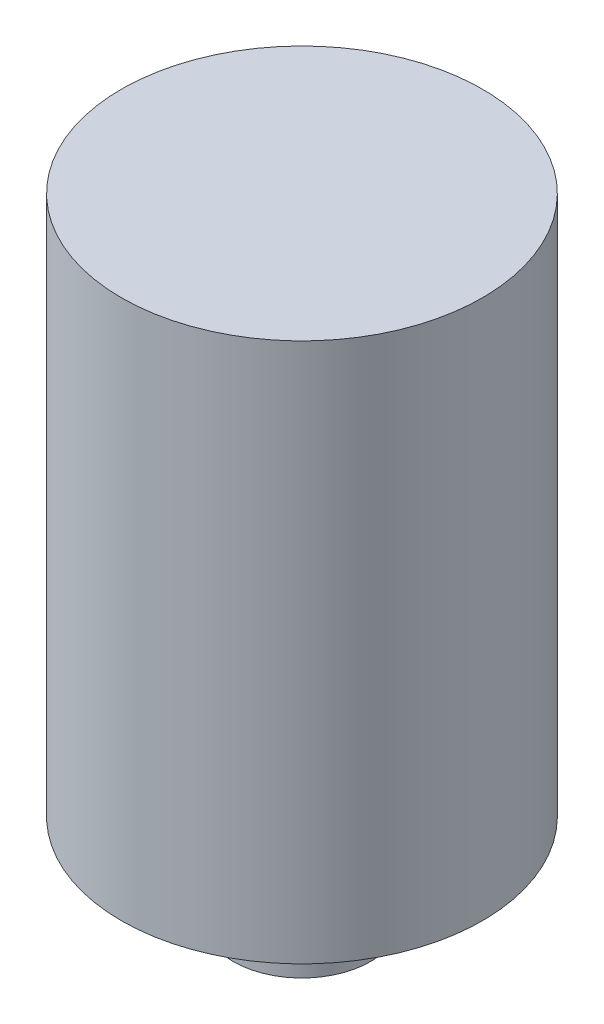
ISO-10303-21;
HEADER;
FILE_DESCRIPTION(('STEP AP214'),'2;1');
FILE_NAME('part.step','',(''),(''),'','','');
FILE_SCHEMA(('AUTOMOTIVE_DESIGN { 1 0 10303 214 1 1 1 1 }'));
ENDSEC;
DATA;
#1=APPLICATION_CONTEXT('core data for automotive mechanical design processes');
#2=APPLICATION_PROTOCOL_DEFINITION('international standard','automotive_design',2000,#1);
#3=PRODUCT_CONTEXT('',#1,'mechanical');
#4=PRODUCT('Part','Part','',(#3));
#5=PRODUCT_RELATED_PRODUCT_CATEGORY('part','',(#4));
#6=PRODUCT_DEFINITION_FORMATION('','',#4);
#7=PRODUCT_DEFINITION_CONTEXT('part definition',#1,'design');
#8=PRODUCT_DEFINITION('design','',#6,#7);
#9=PRODUCT_DEFINITION_SHAPE('','',#8);
#10=(LENGTH_UNIT() NAMED_UNIT(*) SI_UNIT(.MILLI.,.METRE.));
#11=(NAMED_UNIT(*) PLANE_ANGLE_UNIT() SI_UNIT($,.RADIAN.));
#12=(NAMED_UNIT(*) SI_UNIT($,.STERADIAN.) SOLID_ANGLE_UNIT());
#13=UNCERTAINTY_MEASURE_WITH_UNIT(LENGTH_MEASURE(1.E-05),#10,'distance_accuracy_value','');
#14=(GEOMETRIC_REPRESENTATION_CONTEXT(3) GLOBAL_UNCERTAINTY_ASSIGNED_CONTEXT((#13)) GLOBAL_UNIT_ASSIGNED_CONTEXT((#10,
#11,#12)) REPRESENTATION_CONTEXT('',''));
#15=CARTESIAN_POINT('',(0.,0.,0.));
#16=DIRECTION('',(0.,0.,1.));
#17=DIRECTION('',(1.,0.,0.));
#18=AXIS2_PLACEMENT_3D('',#15,#16,#17);
#19=CARTESIAN_POINT('',(0.,0.,0.));
#20=DIRECTION('',(0.,-1.,0.));
#21=DIRECTION('',(0.,0.,-1.));
#22=AXIS2_PLACEMENT_3D('',#19,#20,#21);
#23=PLANE('',#22);
#24=CARTESIAN_POINT('',(0.,0.,0.));
#25=DIRECTION('',(0.,1.,0.));
#26=DIRECTION('',(0.,0.,1.));
#27=AXIS2_PLACEMENT_3D('',#24,#25,#26);
#28=CIRCLE('',#27,1.5);
#29=CARTESIAN_POINT('',(0.,0.,1.5));
#30=VERTEX_POINT('',#29);
#31=EDGE_CURVE('E12',#30,#30,#28,.T.);
#32=ORIENTED_EDGE('',*,*,#31,.F.);
#33=EDGE_LOOP('',(#32));
#34=FACE_BOUND('',#33,.T.);
#35=ADVANCED_FACE('F40',(#34),#23,.T.);
#36=CARTESIAN_POINT('',(0.,0.,0.));
#37=DIRECTION('',(0.,1.,0.));
#38=DIRECTION('',(0.,0.,1.));
#39=AXIS2_PLACEMENT_3D('',#36,#37,#38);
#40=CYLINDRICAL_SURFACE('',#39,1.5);
#41=ORIENTED_EDGE('',*,*,#31,.T.);
#42=EDGE_LOOP('',(#41));
#43=FACE_BOUND('',#42,.T.);
#44=CARTESIAN_POINT('',(0.,2.,0.));
#45=DIRECTION('',(0.,1.,0.));
#46=DIRECTION('',(0.,0.,1.));
#47=AXIS2_PLACEMENT_3D('',#44,#45,#46);
#48=CIRCLE('',#47,1.5);
#49=CARTESIAN_POINT('',(0.,2.,1.5));
#50=VERTEX_POINT('',#49);
#51=EDGE_CURVE('E46',#50,#50,#48,.T.);
#52=ORIENTED_EDGE('',*,*,#51,.F.);
#53=EDGE_LOOP('',(#52));
#54=FACE_BOUND('',#53,.T.);
#55=ADVANCED_FACE('F72',(#43,#54),#40,.T.);
#56=CARTESIAN_POINT('',(-1.5,2.,0.));
#57=DIRECTION('',(0.,-1.,0.));
#58=DIRECTION('',(0.,0.,-1.));
#59=AXIS2_PLACEMENT_3D('',#56,#57,#58);
#60=PLANE('',#59);
#61=ORIENTED_EDGE('',*,*,#51,.T.);
#62=EDGE_LOOP('',(#61));
#63=FACE_BOUND('',#62,.T.);
#64=CARTESIAN_POINT('',(0.,2.,0.));
#65=DIRECTION('',(0.,1.,0.));
#66=DIRECTION('',(0.,0.,1.));
#67=AXIS2_PLACEMENT_3D('',#64,#65,#66);
#68=CIRCLE('',#67,3.95);
#69=CARTESIAN_POINT('',(0.,2.,3.95));
#70=VERTEX_POINT('',#69);
#71=EDGE_CURVE('E50',#70,#70,#68,.T.);
#72=ORIENTED_EDGE('',*,*,#71,.F.);
#73=EDGE_LOOP('',(#72));
#74=FACE_BOUND('',#73,.T.);
#75=ADVANCED_FACE('F64',(#63,#74),#60,.T.);
#76=CARTESIAN_POINT('',(0.,0.,0.));
#77=DIRECTION('',(0.,1.,0.));
#78=DIRECTION('',(0.,0.,1.));
#79=AXIS2_PLACEMENT_3D('',#76,#77,#78);
#80=CYLINDRICAL_SURFACE('',#79,3.95);
#81=ORIENTED_EDGE('',*,*,#71,.T.);
#82=EDGE_LOOP('',(#81));
#83=FACE_BOUND('',#82,.T.);
#84=CARTESIAN_POINT('',(0.,13.8,0.));
#85=DIRECTION('',(0.,1.,0.));
#86=DIRECTION('',(0.,0.,1.));
#87=AXIS2_PLACEMENT_3D('',#84,#85,#86);
#88=CIRCLE('',#87,3.95);
#89=CARTESIAN_POINT('',(0.,13.8,3.95));
#90=VERTEX_POINT('',#89);
#91=EDGE_CURVE('E54',#90,#90,#88,.T.);
#92=ORIENTED_EDGE('',*,*,#91,.F.);
#93=EDGE_LOOP('',(#92));
#94=FACE_BOUND('',#93,.T.);
#95=ADVANCED_FACE('F62',(#83,#94),#80,.T.);
#96=CARTESIAN_POINT('',(-3.95,13.8,0.));
#97=DIRECTION('',(0.,1.,0.));
#98=DIRECTION('',(0.,0.,1.));
#99=AXIS2_PLACEMENT_3D('',#96,#97,#98);
#100=PLANE('',#99);
#101=ORIENTED_EDGE('',*,*,#91,.T.);
#102=EDGE_LOOP('',(#101));
#103=FACE_BOUND('',#102,.T.);
#104=ADVANCED_FACE('F60',(#103),#100,.T.);
#105=CLOSED_SHELL('',(#35,#55,#75,#95,#104));
#106=MANIFOLD_SOLID_BREP('B2',#105);
#107=ADVANCED_BREP_SHAPE_REPRESENTATION('',(#18,#106),#14);
#108=SHAPE_DEFINITION_REPRESENTATION(#9,#107);
ENDSEC;
END-ISO-10303-21;
